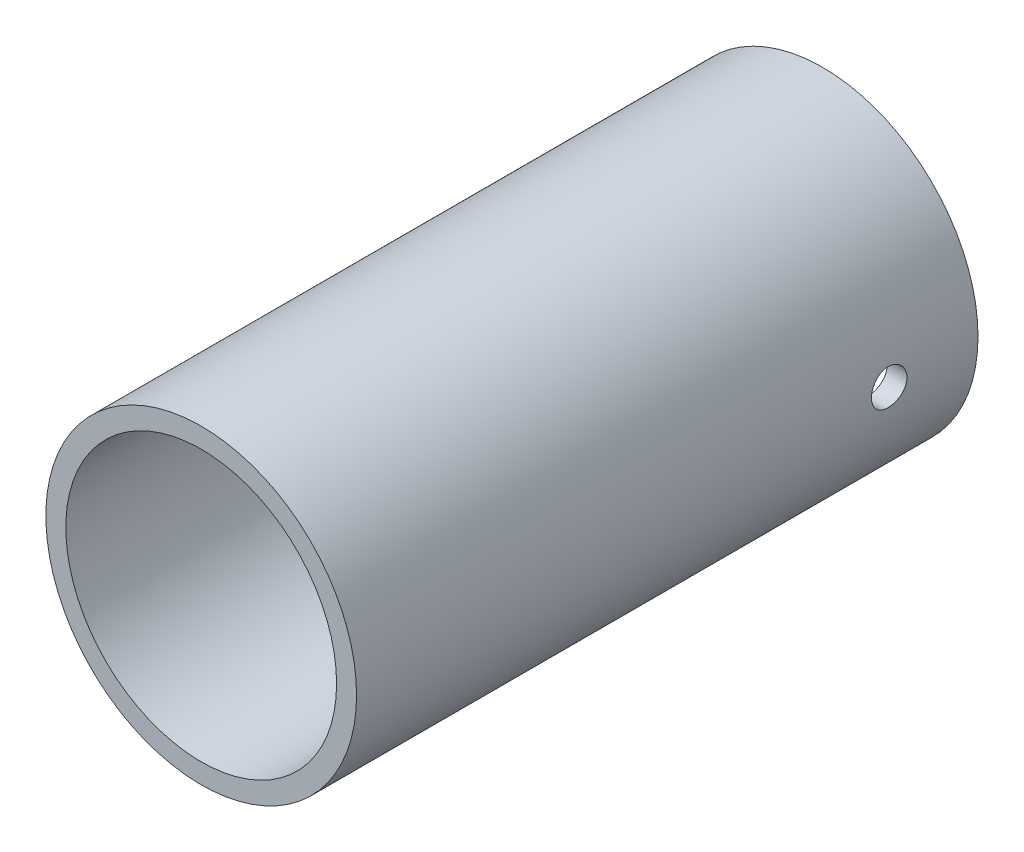
ISO-10303-21;
HEADER;
FILE_DESCRIPTION(('STEP AP214'),'2;1');
FILE_NAME('part.step','',(''),(''),'','','');
FILE_SCHEMA(('AUTOMOTIVE_DESIGN { 1 0 10303 214 1 1 1 1 }'));
ENDSEC;
DATA;
#1=APPLICATION_CONTEXT('core data for automotive mechanical design processes');
#2=APPLICATION_PROTOCOL_DEFINITION('international standard','automotive_design',2000,#1);
#3=PRODUCT_CONTEXT('',#1,'mechanical');
#4=PRODUCT('Part','Part','',(#3));
#5=PRODUCT_RELATED_PRODUCT_CATEGORY('part','',(#4));
#6=PRODUCT_DEFINITION_FORMATION('','',#4);
#7=PRODUCT_DEFINITION_CONTEXT('part definition',#1,'design');
#8=PRODUCT_DEFINITION('design','',#6,#7);
#9=PRODUCT_DEFINITION_SHAPE('','',#8);
#10=(LENGTH_UNIT() NAMED_UNIT(*) SI_UNIT(.MILLI.,.METRE.));
#11=(NAMED_UNIT(*) PLANE_ANGLE_UNIT() SI_UNIT($,.RADIAN.));
#12=(NAMED_UNIT(*) SI_UNIT($,.STERADIAN.) SOLID_ANGLE_UNIT());
#13=UNCERTAINTY_MEASURE_WITH_UNIT(LENGTH_MEASURE(1.E-05),#10,'distance_accuracy_value','');
#14=(GEOMETRIC_REPRESENTATION_CONTEXT(3) GLOBAL_UNCERTAINTY_ASSIGNED_CONTEXT((#13)) GLOBAL_UNIT_ASSIGNED_CONTEXT((#10,
#11,#12)) REPRESENTATION_CONTEXT('',''));
#15=CARTESIAN_POINT('',(0.,0.,0.));
#16=DIRECTION('',(0.,0.,1.));
#17=DIRECTION('',(1.,0.,0.));
#18=AXIS2_PLACEMENT_3D('',#15,#16,#17);
#19=CARTESIAN_POINT('',(0.,0.,7.));
#20=DIRECTION('',(0.,0.,1.));
#21=DIRECTION('',(1.,0.,0.));
#22=AXIS2_PLACEMENT_3D('',#19,#20,#21);
#23=PLANE('',#22);
#24=CARTESIAN_POINT('',(0.,0.,7.));
#25=DIRECTION('',(0.,0.,1.));
#26=DIRECTION('',(1.,0.,0.));
#27=AXIS2_PLACEMENT_3D('',#24,#25,#26);
#28=CIRCLE('',#27,3.5);
#29=CARTESIAN_POINT('',(3.5,0.,7.));
#30=VERTEX_POINT('',#29);
#31=EDGE_CURVE('E10',#30,#30,#28,.T.);
#32=ORIENTED_EDGE('',*,*,#31,.T.);
#33=EDGE_LOOP('',(#32));
#34=FACE_BOUND('',#33,.T.);
#35=CARTESIAN_POINT('',(0.,0.,7.));
#36=DIRECTION('',(0.,0.,1.));
#37=DIRECTION('',(1.,0.,0.));
#38=AXIS2_PLACEMENT_3D('',#35,#36,#37);
#39=CIRCLE('',#38,3.05);
#40=CARTESIAN_POINT('',(3.05,0.,7.));
#41=VERTEX_POINT('',#40);
#42=EDGE_CURVE('E59',#41,#41,#39,.T.);
#43=ORIENTED_EDGE('',*,*,#42,.F.);
#44=EDGE_LOOP('',(#43));
#45=FACE_BOUND('',#44,.T.);
#46=ADVANCED_FACE('F45',(#34,#45),#23,.T.);
#47=CARTESIAN_POINT('',(0.,0.,7.));
#48=DIRECTION('',(0.,0.,-1.));
#49=DIRECTION('',(-1.,0.,0.));
#50=AXIS2_PLACEMENT_3D('',#47,#48,#49);
#51=CYLINDRICAL_SURFACE('',#50,3.5);
#52=CARTESIAN_POINT('',(3.5,0.,-5.4));
#53=CARTESIAN_POINT('',(3.49999971021365,-0.0223898562262544,-5.39999903994444));
#54=CARTESIAN_POINT('',(3.49978287933917,-0.0447940740568337,-5.39811376938266));
#55=CARTESIAN_POINT('',(3.49893875155386,-0.088980124516647,-5.3906222228669));
#56=CARTESIAN_POINT('',(3.49831101528996,-0.110761264884781,-5.38501196394521));
#57=CARTESIAN_POINT('',(3.49671585949015,-0.153054999142426,-5.37023698790855));
#58=CARTESIAN_POINT('',(3.49574865798154,-0.173568397338889,-5.36107455184553));
#59=CARTESIAN_POINT('',(3.4935824066351,-0.212762120472353,-5.33946005185796));
#60=CARTESIAN_POINT('',(3.49238339945121,-0.231442781694507,-5.32700859298347));
#61=CARTESIAN_POINT('',(3.48988138768098,-0.266531567029554,-5.29910765525852));
#62=CARTESIAN_POINT('',(3.48857797358678,-0.282929975324166,-5.2836459931241));
#63=CARTESIAN_POINT('',(3.48601739052391,-0.312905159159939,-5.25018964873297));
#64=CARTESIAN_POINT('',(3.48476022381226,-0.32648179714095,-5.23219484305824));
#65=CARTESIAN_POINT('',(3.48243039132275,-0.350463500935835,-5.19412084650819));
#66=CARTESIAN_POINT('',(3.48135825114113,-0.360859594532153,-5.1740359693672));
#67=CARTESIAN_POINT('',(3.47952514217531,-0.378127810821553,-5.13239120751369));
#68=CARTESIAN_POINT('',(3.47876416347773,-0.385000045784079,-5.11083136981794));
#69=CARTESIAN_POINT('',(3.47764337133823,-0.394996241203211,-5.0669488373591));
#70=CARTESIAN_POINT('',(3.47728181496355,-0.398136491262388,-5.04462989855473));
#71=CARTESIAN_POINT('',(3.47699544141153,-0.400629959278033,-4.99977908131659));
#72=CARTESIAN_POINT('',(3.47707060945071,-0.399983305424283,-4.97724721011652));
#73=CARTESIAN_POINT('',(3.47764759753757,-0.39493471755652,-4.93272308460977));
#74=CARTESIAN_POINT('',(3.47814738711682,-0.390550654860013,-4.91072877384157));
#75=CARTESIAN_POINT('',(3.47951413666169,-0.378179545724229,-4.86779012378032));
#76=CARTESIAN_POINT('',(3.48038110294438,-0.370192437296331,-4.8468458025587));
#77=CARTESIAN_POINT('',(3.48238684044008,-0.350822517381259,-4.80654571818735));
#78=CARTESIAN_POINT('',(3.48352623797615,-0.339431865810801,-4.78719375575374));
#79=CARTESIAN_POINT('',(3.48594795433517,-0.31358381782792,-4.75066934145126));
#80=CARTESIAN_POINT('',(3.48723027862444,-0.299126304102315,-4.73349697299607));
#81=CARTESIAN_POINT('',(3.48980240183633,-0.267455532201409,-4.70171542166145));
#82=CARTESIAN_POINT('',(3.49109220119919,-0.250226856097098,-4.68712159860465));
#83=CARTESIAN_POINT('',(3.49352699828405,-0.213556108689289,-4.66103074927563));
#84=CARTESIAN_POINT('',(3.49467199575855,-0.194114033602624,-4.64953372829661));
#85=CARTESIAN_POINT('',(3.49668872991965,-0.15355707998184,-4.6299631164025));
#86=CARTESIAN_POINT('',(3.49756039646041,-0.132441773779521,-4.62189040409223));
#87=CARTESIAN_POINT('',(3.49893158874182,-0.0891432011111847,-4.60940932993522));
#88=CARTESIAN_POINT('',(3.49943112903215,-0.0669599764355738,-4.60500082482169));
#89=CARTESIAN_POINT('',(3.49999990392717,-0.0222881694378285,-4.59999302161163));
#90=CARTESIAN_POINT('',(3.50007153055525,0.000198009852777008,-4.59937254811419));
#91=CARTESIAN_POINT('',(3.49978284603153,0.0449540286429058,-4.60190265984528));
#92=CARTESIAN_POINT('',(3.49942254253953,0.067223871971853,-4.60505317819935));
#93=CARTESIAN_POINT('',(3.49831198791391,0.110853198887709,-4.61501826071912));
#94=CARTESIAN_POINT('',(3.49756280271168,0.13221499914308,-4.62182281087321));
#95=CARTESIAN_POINT('',(3.49575843499789,0.173494121309308,-4.63889244447533));
#96=CARTESIAN_POINT('',(3.49470324367418,0.193411401601285,-4.64915762758152));
#97=CARTESIAN_POINT('',(3.49239871093812,0.23133121113976,-4.67290895213295));
#98=CARTESIAN_POINT('',(3.49114854619441,0.249325048496218,-4.68640888926225));
#99=CARTESIAN_POINT('',(3.48859672381109,0.282798965373991,-4.71622687188116));
#100=CARTESIAN_POINT('',(3.4872950644741,0.29827896194751,-4.73254501032472));
#101=CARTESIAN_POINT('',(3.48477965930972,0.326360178574667,-4.76762906488034));
#102=CARTESIAN_POINT('',(3.4835663588079,0.338947424431311,-4.78640620242613));
#103=CARTESIAN_POINT('',(3.48137213485487,0.36078951188421,-4.82582038441006));
#104=CARTESIAN_POINT('',(3.48039120740389,0.370044410840425,-4.84645739682638));
#105=CARTESIAN_POINT('',(3.47877572574987,0.384936115399212,-4.88895914255295));
#106=CARTESIAN_POINT('',(3.47814039881523,0.390580997682981,-4.91082101535791));
#107=CARTESIAN_POINT('',(3.47728575983274,0.398118534828238,-4.95519000218505));
#108=CARTESIAN_POINT('',(3.4770664318414,0.400011333491316,-4.97769709144527));
#109=CARTESIAN_POINT('',(3.4770690327478,0.399988629374111,-5.02257866152777));
#110=CARTESIAN_POINT('',(3.47728841817671,0.398095078201033,-5.04495315680461));
#111=CARTESIAN_POINT('',(3.47813827936561,0.390599701753458,-5.08906379761761));
#112=CARTESIAN_POINT('',(3.47876875537848,0.38499787419795,-5.11079994276111));
#113=CARTESIAN_POINT('',(3.48036900976955,0.370251466013705,-5.15301520867245));
#114=CARTESIAN_POINT('',(3.48133870455158,0.361107758177137,-5.17349463768191));
#115=CARTESIAN_POINT('',(3.48350828979623,0.339539332785358,-5.21263183632125));
#116=CARTESIAN_POINT('',(3.48470818125814,0.327114600987134,-5.23128959804274));
#117=CARTESIAN_POINT('',(3.48721130366565,0.2992548552238,-5.26636622672522));
#118=CARTESIAN_POINT('',(3.48851507274317,0.283803467202948,-5.28277205078111));
#119=CARTESIAN_POINT('',(3.49107421229161,0.250362623026178,-5.31276685478803));
#120=CARTESIAN_POINT('',(3.49232957120036,0.232372565262226,-5.32635516516098));
#121=CARTESIAN_POINT('',(3.49465479223622,0.194300034110024,-5.3503652344662));
#122=CARTESIAN_POINT('',(3.49572404690299,0.174211038832958,-5.36077670421353));
#123=CARTESIAN_POINT('',(3.49755026854777,0.132569587879359,-5.37806404242304));
#124=CARTESIAN_POINT('',(3.49830758051356,0.111018779769742,-5.38494381878794));
#125=CARTESIAN_POINT('',(3.49923848958367,0.074459617138529,-5.39329422045302));
#126=CARTESIAN_POINT('',(3.49952269210682,0.0596833261820646,-5.39580535575123));
#127=CARTESIAN_POINT('',(3.4999035436688,0.0299401637320372,-5.39915856170394));
#128=CARTESIAN_POINT('',(3.50000019379562,0.0149732933445127,-5.40000064204046));
#129=CARTESIAN_POINT('',(3.5,0.,-5.4));
#130=B_SPLINE_CURVE_WITH_KNOTS('',3,(#52,#53,#54,#55,#56,#57,#58,#59,#60,#61,#62,#63,#64,#65,
#66,#67,#68,#69,#70,#71,#72,#73,#74,#75,#76,#77,#78,#79,#80,#81,#82,#83,#84,#85,#86,#87,#88,#89,
#90,#91,#92,#93,#94,#95,#96,#97,#98,#99,#100,#101,#102,#103,#104,#105,#106,#107,#108,#109,#110,
#111,#112,#113,#114,#115,#116,#117,#118,#119,#120,#121,#122,#123,#124,#125,#126,#127,#128,#129),
.UNSPECIFIED.,.T.,.F.,(4,2,2,2,2,2,2,2,2,2,2,2,2,2,2,2,2,2,2,2,2,2,2,2,2,2,2,2,2,2,2,2,2,2,2,2,
2,2,4),(0.,0.0671148833328561,0.134301645503665,0.201445334563241,0.268576680432396,
0.335985599789753,0.403397804534027,0.470998459859539,0.538596961307605,0.605899308004499,
0.673199376475319,0.74017942704648,0.807160630020253,0.87429732993756,0.941436598421781,
1.0089632245958,1.07648996618884,1.14403402324395,1.2115754392709,1.27873894505867,
1.34590125979196,1.41288044606783,1.47986156135286,1.54713359017113,1.614407838276,
1.6820005437816,1.74959208575276,1.81703187135957,1.88446907223297,1.95151643514368,
2.01856383929617,2.08559473208865,2.15262591586881,2.22003028269161,2.28745064975239,
2.35508711583513,2.42264857835784,2.46753214774395,2.51241545676436),.UNSPECIFIED.);
#131=CARTESIAN_POINT('',(3.5,0.,-5.4));
#132=VERTEX_POINT('',#131);
#133=EDGE_CURVE('E86',#132,#132,#130,.T.);
#134=ORIENTED_EDGE('',*,*,#133,.T.);
#135=EDGE_LOOP('',(#134));
#136=FACE_BOUND('',#135,.T.);
#137=CARTESIAN_POINT('',(-3.5,0.,-5.4));
#138=CARTESIAN_POINT('',(-3.49999971021365,0.0223898562262544,-5.39999903994444));
#139=CARTESIAN_POINT('',(-3.49978287933917,0.0447940740568337,-5.39811376938266));
#140=CARTESIAN_POINT('',(-3.49893875155386,0.088980124516647,-5.3906222228669));
#141=CARTESIAN_POINT('',(-3.49831101528996,0.110761264884781,-5.38501196394521));
#142=CARTESIAN_POINT('',(-3.49671585949015,0.153054999142426,-5.37023698790855));
#143=CARTESIAN_POINT('',(-3.49574865798154,0.173568397338889,-5.36107455184553));
#144=CARTESIAN_POINT('',(-3.4935824066351,0.212762120472353,-5.33946005185796));
#145=CARTESIAN_POINT('',(-3.49238339945121,0.231442781694507,-5.32700859298347));
#146=CARTESIAN_POINT('',(-3.48988138768098,0.266531567029554,-5.29910765525852));
#147=CARTESIAN_POINT('',(-3.48857797358678,0.282929975324166,-5.2836459931241));
#148=CARTESIAN_POINT('',(-3.48601739052391,0.312905159159939,-5.25018964873297));
#149=CARTESIAN_POINT('',(-3.48476022381226,0.32648179714095,-5.23219484305824));
#150=CARTESIAN_POINT('',(-3.48243039132275,0.350463500935835,-5.19412084650819));
#151=CARTESIAN_POINT('',(-3.48135825114113,0.360859594532153,-5.1740359693672));
#152=CARTESIAN_POINT('',(-3.47952514217531,0.378127810821553,-5.13239120751369));
#153=CARTESIAN_POINT('',(-3.47876416347773,0.385000045784079,-5.11083136981794));
#154=CARTESIAN_POINT('',(-3.47764337133823,0.394996241203211,-5.0669488373591));
#155=CARTESIAN_POINT('',(-3.47728181496355,0.398136491262388,-5.04462989855473));
#156=CARTESIAN_POINT('',(-3.47699544141153,0.400629959278033,-4.99977908131659));
#157=CARTESIAN_POINT('',(-3.47707060945071,0.399983305424283,-4.97724721011652));
#158=CARTESIAN_POINT('',(-3.47764759753757,0.39493471755652,-4.93272308460977));
#159=CARTESIAN_POINT('',(-3.47814738711682,0.390550654860013,-4.91072877384157));
#160=CARTESIAN_POINT('',(-3.47951413666169,0.378179545724229,-4.86779012378032));
#161=CARTESIAN_POINT('',(-3.48038110294438,0.370192437296331,-4.8468458025587));
#162=CARTESIAN_POINT('',(-3.48238684044008,0.350822517381259,-4.80654571818735));
#163=CARTESIAN_POINT('',(-3.48352623797615,0.339431865810801,-4.78719375575374));
#164=CARTESIAN_POINT('',(-3.48594795433517,0.31358381782792,-4.75066934145126));
#165=CARTESIAN_POINT('',(-3.48723027862444,0.299126304102315,-4.73349697299607));
#166=CARTESIAN_POINT('',(-3.48980240183633,0.267455532201409,-4.70171542166145));
#167=CARTESIAN_POINT('',(-3.49109220119919,0.250226856097098,-4.68712159860465));
#168=CARTESIAN_POINT('',(-3.49352699828405,0.213556108689289,-4.66103074927563));
#169=CARTESIAN_POINT('',(-3.49467199575855,0.194114033602624,-4.64953372829661));
#170=CARTESIAN_POINT('',(-3.49668872991965,0.15355707998184,-4.6299631164025));
#171=CARTESIAN_POINT('',(-3.49756039646041,0.132441773779521,-4.62189040409223));
#172=CARTESIAN_POINT('',(-3.49893158874182,0.0891432011111847,-4.60940932993522));
#173=CARTESIAN_POINT('',(-3.49943112903215,0.0669599764355738,-4.60500082482169));
#174=CARTESIAN_POINT('',(-3.49999990392717,0.0222881694378285,-4.59999302161163));
#175=CARTESIAN_POINT('',(-3.50007153055525,-0.000198009852777008,-4.59937254811419));
#176=CARTESIAN_POINT('',(-3.49978284603153,-0.0449540286429058,-4.60190265984528));
#177=CARTESIAN_POINT('',(-3.49942254253953,-0.067223871971853,-4.60505317819935));
#178=CARTESIAN_POINT('',(-3.49831198791391,-0.110853198887709,-4.61501826071912));
#179=CARTESIAN_POINT('',(-3.49756280271168,-0.13221499914308,-4.62182281087321));
#180=CARTESIAN_POINT('',(-3.49575843499789,-0.173494121309308,-4.63889244447533));
#181=CARTESIAN_POINT('',(-3.49470324367418,-0.193411401601285,-4.64915762758152));
#182=CARTESIAN_POINT('',(-3.49239871093812,-0.23133121113976,-4.67290895213295));
#183=CARTESIAN_POINT('',(-3.49114854619441,-0.249325048496218,-4.68640888926225));
#184=CARTESIAN_POINT('',(-3.48859672381109,-0.282798965373991,-4.71622687188116));
#185=CARTESIAN_POINT('',(-3.4872950644741,-0.29827896194751,-4.73254501032472));
#186=CARTESIAN_POINT('',(-3.48477965930972,-0.326360178574667,-4.76762906488034));
#187=CARTESIAN_POINT('',(-3.4835663588079,-0.338947424431311,-4.78640620242613));
#188=CARTESIAN_POINT('',(-3.48137213485487,-0.36078951188421,-4.82582038441006));
#189=CARTESIAN_POINT('',(-3.48039120740389,-0.370044410840425,-4.84645739682638));
#190=CARTESIAN_POINT('',(-3.47877572574987,-0.384936115399212,-4.88895914255295));
#191=CARTESIAN_POINT('',(-3.47814039881523,-0.390580997682981,-4.91082101535791));
#192=CARTESIAN_POINT('',(-3.47728575983274,-0.398118534828238,-4.95519000218505));
#193=CARTESIAN_POINT('',(-3.4770664318414,-0.400011333491316,-4.97769709144527));
#194=CARTESIAN_POINT('',(-3.4770690327478,-0.399988629374111,-5.02257866152777));
#195=CARTESIAN_POINT('',(-3.47728841817671,-0.398095078201033,-5.04495315680461));
#196=CARTESIAN_POINT('',(-3.47813827936561,-0.390599701753458,-5.08906379761761));
#197=CARTESIAN_POINT('',(-3.47876875537848,-0.38499787419795,-5.11079994276111));
#198=CARTESIAN_POINT('',(-3.48036900976955,-0.370251466013705,-5.15301520867245));
#199=CARTESIAN_POINT('',(-3.48133870455158,-0.361107758177137,-5.17349463768191));
#200=CARTESIAN_POINT('',(-3.48350828979623,-0.339539332785358,-5.21263183632125));
#201=CARTESIAN_POINT('',(-3.48470818125814,-0.327114600987134,-5.23128959804274));
#202=CARTESIAN_POINT('',(-3.48721130366565,-0.2992548552238,-5.26636622672522));
#203=CARTESIAN_POINT('',(-3.48851507274317,-0.283803467202948,-5.28277205078111));
#204=CARTESIAN_POINT('',(-3.49107421229161,-0.250362623026178,-5.31276685478803));
#205=CARTESIAN_POINT('',(-3.49232957120036,-0.232372565262226,-5.32635516516098));
#206=CARTESIAN_POINT('',(-3.49465479223622,-0.194300034110024,-5.3503652344662));
#207=CARTESIAN_POINT('',(-3.49572404690299,-0.174211038832958,-5.36077670421353));
#208=CARTESIAN_POINT('',(-3.49755026854777,-0.132569587879359,-5.37806404242304));
#209=CARTESIAN_POINT('',(-3.49830758051356,-0.111018779769742,-5.38494381878794));
#210=CARTESIAN_POINT('',(-3.49923848958367,-0.074459617138529,-5.39329422045302));
#211=CARTESIAN_POINT('',(-3.49952269210682,-0.0596833261820646,-5.39580535575123));
#212=CARTESIAN_POINT('',(-3.4999035436688,-0.0299401637320372,-5.39915856170394));
#213=CARTESIAN_POINT('',(-3.50000019379562,-0.0149732933445127,-5.40000064204046));
#214=CARTESIAN_POINT('',(-3.5,0.,-5.4));
#215=B_SPLINE_CURVE_WITH_KNOTS('',3,(#137,#138,#139,#140,#141,#142,#143,#144,#145,#146,#147,
#148,#149,#150,#151,#152,#153,#154,#155,#156,#157,#158,#159,#160,#161,#162,#163,#164,#165,#166,
#167,#168,#169,#170,#171,#172,#173,#174,#175,#176,#177,#178,#179,#180,#181,#182,#183,#184,#185,
#186,#187,#188,#189,#190,#191,#192,#193,#194,#195,#196,#197,#198,#199,#200,#201,#202,#203,#204,
#205,#206,#207,#208,#209,#210,#211,#212,#213,#214),.UNSPECIFIED.,.T.,.F.,(4,2,2,2,2,2,2,2,2,2,2,
2,2,2,2,2,2,2,2,2,2,2,2,2,2,2,2,2,2,2,2,2,2,2,2,2,2,2,4),(0.,0.0671148833328561,
0.134301645503665,0.201445334563241,0.268576680432396,0.335985599789753,0.403397804534027,
0.470998459859539,0.538596961307605,0.605899308004499,0.673199376475319,0.74017942704648,
0.807160630020253,0.87429732993756,0.941436598421781,1.0089632245958,1.07648996618884,
1.14403402324395,1.2115754392709,1.27873894505867,1.34590125979196,1.41288044606783,
1.47986156135286,1.54713359017113,1.614407838276,1.6820005437816,1.74959208575276,
1.81703187135957,1.88446907223297,1.95151643514368,2.01856383929617,2.08559473208865,
2.15262591586881,2.22003028269161,2.28745064975239,2.35508711583513,2.42264857835784,
2.46753214774395,2.51241545676436),.UNSPECIFIED.);
#216=CARTESIAN_POINT('',(-3.5,0.,-5.4));
#217=VERTEX_POINT('',#216);
#218=EDGE_CURVE('E91',#217,#217,#215,.T.);
#219=ORIENTED_EDGE('',*,*,#218,.T.);
#220=EDGE_LOOP('',(#219));
#221=FACE_BOUND('',#220,.T.);
#222=ORIENTED_EDGE('',*,*,#31,.F.);
#223=EDGE_LOOP('',(#222));
#224=FACE_BOUND('',#223,.T.);
#225=CARTESIAN_POINT('',(0.,0.,-7.));
#226=DIRECTION('',(0.,0.,1.));
#227=DIRECTION('',(1.,0.,0.));
#228=AXIS2_PLACEMENT_3D('',#225,#226,#227);
#229=CIRCLE('',#228,3.5);
#230=CARTESIAN_POINT('',(3.5,0.,-7.));
#231=VERTEX_POINT('',#230);
#232=EDGE_CURVE('E64',#231,#231,#229,.T.);
#233=ORIENTED_EDGE('',*,*,#232,.T.);
#234=EDGE_LOOP('',(#233));
#235=FACE_BOUND('',#234,.T.);
#236=ADVANCED_FACE('F47',(#136,#221,#224,#235),#51,.T.);
#237=CARTESIAN_POINT('',(0.,0.,7.));
#238=DIRECTION('',(0.,0.,-1.));
#239=DIRECTION('',(-1.,0.,0.));
#240=AXIS2_PLACEMENT_3D('',#237,#238,#239);
#241=CYLINDRICAL_SURFACE('',#240,3.05);
#242=CARTESIAN_POINT('',(-3.05,0.,-4.6));
#243=CARTESIAN_POINT('',(-3.04999967567675,-0.0223652045310429,-4.60000094430966));
#244=CARTESIAN_POINT('',(-3.04975140532122,-0.0447441565428265,-4.60188208533576));
#245=CARTESIAN_POINT('',(-3.0487848893789,-0.0888786894735394,-4.60935626715322));
#246=CARTESIAN_POINT('',(-3.04806616066089,-0.110633605547908,-4.6149531238356));
#247=CARTESIAN_POINT('',(-3.04623965094681,-0.152874790274292,-4.62969045314019));
#248=CARTESIAN_POINT('',(-3.04513213930745,-0.17336192574065,-4.63882847282697));
#249=CARTESIAN_POINT('',(-3.04265105781359,-0.212508188004251,-4.66038321727098));
#250=CARTESIAN_POINT('',(-3.04127753160043,-0.231167613893463,-4.67279940434586));
#251=CARTESIAN_POINT('',(-3.03840836293451,-0.266245130495356,-4.70063808809834));
#252=CARTESIAN_POINT('',(-3.03691210207143,-0.282650595866473,-4.71607643094902));
#253=CARTESIAN_POINT('',(-3.0339710542058,-0.31264571972163,-4.74948714004339));
#254=CARTESIAN_POINT('',(-3.03252626990361,-0.32623523066544,-4.76745963897979));
#255=CARTESIAN_POINT('',(-3.02984569939782,-0.350260232692426,-4.80551121129021));
#256=CARTESIAN_POINT('',(-3.02861071073445,-0.36068380167134,-4.82559787307311));
#257=CARTESIAN_POINT('',(-3.02649779574097,-0.378004884745517,-4.8672555421107));
#258=CARTESIAN_POINT('',(-3.02561985452974,-0.384902545797728,-4.88882648745915));
#259=CARTESIAN_POINT('',(-3.02432639244563,-0.394937441949649,-4.93270892114188));
#260=CARTESIAN_POINT('',(-3.02390824176772,-0.398096070752991,-4.95501543835037));
#261=CARTESIAN_POINT('',(-3.02357367480987,-0.400629457699287,-4.99984555188705));
#262=CARTESIAN_POINT('',(-3.02365723638528,-0.400004382847933,-5.02236913859038));
#263=CARTESIAN_POINT('',(-3.02431424596193,-0.395005649426819,-5.06684447028074));
#264=CARTESIAN_POINT('',(-3.0248846063809,-0.390655616296935,-5.08879892272459));
#265=CARTESIAN_POINT('',(-3.0264461313835,-0.378367337172484,-5.13166353902046));
#266=CARTESIAN_POINT('',(-3.02743730527565,-0.370429011803466,-5.15257367976055));
#267=CARTESIAN_POINT('',(-3.02973225760621,-0.351164283947918,-5.19282915783753));
#268=CARTESIAN_POINT('',(-3.03103697540731,-0.339827674625178,-5.21216955483477));
#269=CARTESIAN_POINT('',(-3.03381129239396,-0.314095477495971,-5.24868238573322));
#270=CARTESIAN_POINT('',(-3.03528089987459,-0.299699735761801,-5.26585471047324));
#271=CARTESIAN_POINT('',(-3.03823311573054,-0.268127269313213,-5.2976810211139));
#272=CARTESIAN_POINT('',(-3.03971573785138,-0.250930192272551,-5.31231482330171));
#273=CARTESIAN_POINT('',(-3.04251647181268,-0.214313128935372,-5.33849133222503));
#274=CARTESIAN_POINT('',(-3.04383458320572,-0.194893136593448,-5.35003403055373));
#275=CARTESIAN_POINT('',(-3.04615871780272,-0.154365497304131,-5.36970092531347));
#276=CARTESIAN_POINT('',(-3.0471646194519,-0.133257197048755,-5.37782379071498));
#277=CARTESIAN_POINT('',(-3.04874991788146,-0.0899600819396528,-5.39040407025288));
#278=CARTESIAN_POINT('',(-3.04932933665476,-0.0677713228661068,-5.39486167340144));
#279=CARTESIAN_POINT('',(-3.04999351374235,-0.0231175917834736,-5.39995857819447));
#280=CARTESIAN_POINT('',(-3.05008187228908,-0.000655843403997384,-5.40062567096565));
#281=CARTESIAN_POINT('',(-3.04976371212408,0.0440591418582799,-5.39819605738443));
#282=CARTESIAN_POINT('',(-3.0493572050396,0.0663123836277246,-5.39509943946331));
#283=CARTESIAN_POINT('',(-3.04809722704062,0.109896165213696,-5.38525339972195));
#284=CARTESIAN_POINT('',(-3.04724538604789,0.131229764739027,-5.37851729542854));
#285=CARTESIAN_POINT('',(-3.04519006652876,0.172464582125677,-5.36159738736461));
#286=CARTESIAN_POINT('',(-3.04398657497835,0.192365746900146,-5.35141345589534));
#287=CARTESIAN_POINT('',(-3.04135305166816,0.23029445404851,-5.32782020817234));
#288=CARTESIAN_POINT('',(-3.03992177843504,0.248310775755855,-5.31439299447293));
#289=CARTESIAN_POINT('',(-3.03699650727889,0.281844059217536,-5.28471955835665));
#290=CARTESIAN_POINT('',(-3.03550250660692,0.297360911291633,-5.26847321229724));
#291=CARTESIAN_POINT('',(-3.03260898392204,0.325553973391073,-5.23349996004918));
#292=CARTESIAN_POINT('',(-3.03121011489502,0.338211712418732,-5.21475810182059));
#293=CARTESIAN_POINT('',(-3.02867617432123,0.360199457524109,-5.17539806909127));
#294=CARTESIAN_POINT('',(-3.0275410970434,0.369529535899879,-5.15477993536745));
#295=CARTESIAN_POINT('',(-3.02566777588543,0.384567499539058,-5.11231118280736));
#296=CARTESIAN_POINT('',(-3.02492840950823,0.390285639049092,-5.09046424658905));
#297=CARTESIAN_POINT('',(-3.0239270606461,0.397970348714084,-5.04610990089657));
#298=CARTESIAN_POINT('',(-3.02366505352349,0.399937112486985,-5.0236025255702));
#299=CARTESIAN_POINT('',(-3.02364885482862,0.400059446602371,-4.97875003544065));
#300=CARTESIAN_POINT('',(-3.02389079618287,0.398244039596346,-4.95640499567179));
#301=CARTESIAN_POINT('',(-3.02484689920391,0.390915192292119,-4.91234064544701));
#302=CARTESIAN_POINT('',(-3.02556106075715,0.385401752883166,-4.89062133484061));
#303=CARTESIAN_POINT('',(-3.02737990419805,0.370842701726876,-4.84842977182245));
#304=CARTESIAN_POINT('',(-3.02848441527791,0.361798634718601,-4.82795697854992));
#305=CARTESIAN_POINT('',(-3.03095977032639,0.340437908229655,-4.78881484170646));
#306=CARTESIAN_POINT('',(-3.03233061895498,0.328121191487853,-4.77014552969861));
#307=CARTESIAN_POINT('',(-3.03519677742117,0.300457599639196,-4.73499213561121));
#308=CARTESIAN_POINT('',(-3.03669292799225,0.285089118241545,-4.71852512354027));
#309=CARTESIAN_POINT('',(-3.03963377898097,0.251803561772006,-4.68839288369009));
#310=CARTESIAN_POINT('',(-3.04107846723062,0.233885888893133,-4.67472831494791));
#311=CARTESIAN_POINT('',(-3.04376035131562,0.195924018168824,-4.65053955008888));
#312=CARTESIAN_POINT('',(-3.04499665462743,0.175871244846095,-4.64002871893526));
#313=CARTESIAN_POINT('',(-3.04711351891615,0.134279746364772,-4.62253900322909));
#314=CARTESIAN_POINT('',(-3.04799446210933,0.112742647070003,-4.61555632183529));
#315=CARTESIAN_POINT('',(-3.04909155056231,0.0759144688872918,-4.60697269104741));
#316=CARTESIAN_POINT('',(-3.04943053904308,0.0608545892345614,-4.6043617434999));
#317=CARTESIAN_POINT('',(-3.0498848735313,0.0305319411792384,-4.60087508293264));
#318=CARTESIAN_POINT('',(-3.050000221422,0.0152691744862213,-4.59999935530082));
#319=CARTESIAN_POINT('',(-3.05,0.,-4.6));
#320=B_SPLINE_CURVE_WITH_KNOTS('',3,(#242,#243,#244,#245,#246,#247,#248,#249,#250,#251,#252,
#253,#254,#255,#256,#257,#258,#259,#260,#261,#262,#263,#264,#265,#266,#267,#268,#269,#270,#271,
#272,#273,#274,#275,#276,#277,#278,#279,#280,#281,#282,#283,#284,#285,#286,#287,#288,#289,#290,
#291,#292,#293,#294,#295,#296,#297,#298,#299,#300,#301,#302,#303,#304,#305,#306,#307,#308,#309,
#310,#311,#312,#313,#314,#315,#316,#317,#318,#319),.UNSPECIFIED.,.T.,.F.,(4,2,2,2,2,2,2,2,2,2,2,
2,2,2,2,2,2,2,2,2,2,2,2,2,2,2,2,2,2,2,2,2,2,2,2,2,2,2,4),(0.,0.067039835278284,
0.134148624498459,0.201211010849139,0.268262404507546,0.335675272420039,0.403091671496444,
0.470758882220357,0.538423272400469,0.605698605051119,0.672970968314477,0.739819792317132,
0.806670095114702,0.873723231413717,0.940779742453937,1.0083471486134,1.07591473853259,
1.14350860210416,1.21109897974119,1.27819315485994,1.34528575357992,1.41213449501283,
1.47898571262398,1.54621462066162,1.61344647799502,1.68110099004229,1.74875403211172,
1.81621413449457,1.88367075499754,1.95061165131045,2.0175525315264,2.08446415617685,
2.15137695164849,2.21878155632289,2.28620199408255,2.35390423793764,2.4215334675728,
2.46730329547881,2.51307273796125),.UNSPECIFIED.);
#321=CARTESIAN_POINT('',(-3.05,0.,-4.6));
#322=VERTEX_POINT('',#321);
#323=EDGE_CURVE('E50',#322,#322,#320,.T.);
#324=ORIENTED_EDGE('',*,*,#323,.F.);
#325=EDGE_LOOP('',(#324));
#326=FACE_BOUND('',#325,.T.);
#327=CARTESIAN_POINT('',(3.05,0.,-5.4));
#328=CARTESIAN_POINT('',(3.04999967567675,-0.0223652045310429,-5.39999905569034));
#329=CARTESIAN_POINT('',(3.04975140532122,-0.0447441565428265,-5.39811791466424));
#330=CARTESIAN_POINT('',(3.0487848893789,-0.0888786894735394,-5.39064373284678));
#331=CARTESIAN_POINT('',(3.04806616066089,-0.110633605547908,-5.3850468761644));
#332=CARTESIAN_POINT('',(3.04623965094681,-0.152874790274292,-5.37030954685981));
#333=CARTESIAN_POINT('',(3.04513213930745,-0.17336192574065,-5.36117152717303));
#334=CARTESIAN_POINT('',(3.04265105781359,-0.212508188004251,-5.33961678272902));
#335=CARTESIAN_POINT('',(3.04127753160043,-0.231167613893464,-5.32720059565414));
#336=CARTESIAN_POINT('',(3.03840836293451,-0.266245130495356,-5.29936191190166));
#337=CARTESIAN_POINT('',(3.03691210207143,-0.282650595866473,-5.28392356905098));
#338=CARTESIAN_POINT('',(3.0339710542058,-0.312645719721631,-5.25051285995661));
#339=CARTESIAN_POINT('',(3.03252626990361,-0.326235230665441,-5.23254036102021));
#340=CARTESIAN_POINT('',(3.02984569939782,-0.350260232692426,-5.19448878870979));
#341=CARTESIAN_POINT('',(3.02861071073445,-0.36068380167134,-5.17440212692689));
#342=CARTESIAN_POINT('',(3.02649779574097,-0.378004884745517,-5.1327444578893));
#343=CARTESIAN_POINT('',(3.02561985452974,-0.384902545797728,-5.11117351254085));
#344=CARTESIAN_POINT('',(3.02432639244563,-0.394937441949649,-5.06729107885812));
#345=CARTESIAN_POINT('',(3.02390824176772,-0.398096070752991,-5.04498456164963));
#346=CARTESIAN_POINT('',(3.02357367480987,-0.400629457699287,-5.00015444811295));
#347=CARTESIAN_POINT('',(3.02365723638528,-0.400004382847933,-4.97763086140962));
#348=CARTESIAN_POINT('',(3.02431424596193,-0.395005649426819,-4.93315552971926));
#349=CARTESIAN_POINT('',(3.0248846063809,-0.390655616296935,-4.91120107727541));
#350=CARTESIAN_POINT('',(3.0264461313835,-0.378367337172484,-4.86833646097954));
#351=CARTESIAN_POINT('',(3.02743730527565,-0.370429011803466,-4.84742632023945));
#352=CARTESIAN_POINT('',(3.02973225760621,-0.351164283947918,-4.80717084216247));
#353=CARTESIAN_POINT('',(3.03103697540731,-0.339827674625178,-4.78783044516523));
#354=CARTESIAN_POINT('',(3.03381129239396,-0.314095477495971,-4.75131761426678));
#355=CARTESIAN_POINT('',(3.03528089987459,-0.299699735761801,-4.73414528952676));
#356=CARTESIAN_POINT('',(3.03823311573054,-0.268127269313213,-4.7023189788861));
#357=CARTESIAN_POINT('',(3.03971573785138,-0.250930192272551,-4.6876851766983));
#358=CARTESIAN_POINT('',(3.04251647181268,-0.214313128935373,-4.66150866777498));
#359=CARTESIAN_POINT('',(3.04383458320572,-0.194893136593448,-4.64996596944627));
#360=CARTESIAN_POINT('',(3.04615871780272,-0.154365497304131,-4.63029907468653));
#361=CARTESIAN_POINT('',(3.0471646194519,-0.133257197048755,-4.62217620928502));
#362=CARTESIAN_POINT('',(3.04874991788146,-0.0899600819396528,-4.60959592974712));
#363=CARTESIAN_POINT('',(3.04932933665476,-0.0677713228661068,-4.60513832659856));
#364=CARTESIAN_POINT('',(3.04999351374235,-0.0231175917834737,-4.60004142180553));
#365=CARTESIAN_POINT('',(3.05008187228908,-0.000655843403997422,-4.59937432903435));
#366=CARTESIAN_POINT('',(3.04976371212408,0.0440591418582799,-4.60180394261557));
#367=CARTESIAN_POINT('',(3.0493572050396,0.0663123836277246,-4.60490056053669));
#368=CARTESIAN_POINT('',(3.04809722704062,0.109896165213696,-4.61474660027805));
#369=CARTESIAN_POINT('',(3.04724538604789,0.131229764739027,-4.62148270457146));
#370=CARTESIAN_POINT('',(3.04519006652876,0.172464582125677,-4.63840261263539));
#371=CARTESIAN_POINT('',(3.04398657497835,0.192365746900146,-4.64858654410466));
#372=CARTESIAN_POINT('',(3.04135305166816,0.23029445404851,-4.67217979182766));
#373=CARTESIAN_POINT('',(3.03992177843504,0.248310775755855,-4.68560700552707));
#374=CARTESIAN_POINT('',(3.03699650727889,0.281844059217536,-4.71528044164335));
#375=CARTESIAN_POINT('',(3.03550250660692,0.297360911291632,-4.73152678770276));
#376=CARTESIAN_POINT('',(3.03260898392204,0.325553973391073,-4.76650003995082));
#377=CARTESIAN_POINT('',(3.03121011489502,0.338211712418732,-4.78524189817941));
#378=CARTESIAN_POINT('',(3.02867617432123,0.360199457524109,-4.82460193090873));
#379=CARTESIAN_POINT('',(3.0275410970434,0.369529535899879,-4.84522006463255));
#380=CARTESIAN_POINT('',(3.02566777588543,0.384567499539058,-4.88768881719265));
#381=CARTESIAN_POINT('',(3.02492840950823,0.390285639049092,-4.90953575341095));
#382=CARTESIAN_POINT('',(3.0239270606461,0.397970348714084,-4.95389009910343));
#383=CARTESIAN_POINT('',(3.02366505352349,0.399937112486985,-4.9763974744298));
#384=CARTESIAN_POINT('',(3.02364885482862,0.400059446602371,-5.02124996455935));
#385=CARTESIAN_POINT('',(3.02389079618287,0.398244039596346,-5.04359500432821));
#386=CARTESIAN_POINT('',(3.02484689920391,0.390915192292119,-5.08765935455299));
#387=CARTESIAN_POINT('',(3.02556106075715,0.385401752883166,-5.10937866515939));
#388=CARTESIAN_POINT('',(3.02737990419805,0.370842701726876,-5.15157022817755));
#389=CARTESIAN_POINT('',(3.02848441527791,0.361798634718602,-5.17204302145008));
#390=CARTESIAN_POINT('',(3.03095977032639,0.340437908229656,-5.21118515829354));
#391=CARTESIAN_POINT('',(3.03233061895498,0.328121191487853,-5.22985447030139));
#392=CARTESIAN_POINT('',(3.03519677742117,0.300457599639196,-5.26500786438879));
#393=CARTESIAN_POINT('',(3.03669292799225,0.285089118241545,-5.28147487645973));
#394=CARTESIAN_POINT('',(3.03963377898097,0.251803561772006,-5.31160711630991));
#395=CARTESIAN_POINT('',(3.04107846723062,0.233885888893133,-5.32527168505209));
#396=CARTESIAN_POINT('',(3.04376035131562,0.195924018168824,-5.34946044991112));
#397=CARTESIAN_POINT('',(3.04499665462743,0.175871244846095,-5.35997128106474));
#398=CARTESIAN_POINT('',(3.04711351891615,0.134279746364772,-5.37746099677091));
#399=CARTESIAN_POINT('',(3.04799446210933,0.112742647070003,-5.38444367816471));
#400=CARTESIAN_POINT('',(3.04909155056231,0.0759144688872917,-5.39302730895259));
#401=CARTESIAN_POINT('',(3.04943053904308,0.0608545892345613,-5.3956382565001));
#402=CARTESIAN_POINT('',(3.0498848735313,0.0305319411792382,-5.39912491706736));
#403=CARTESIAN_POINT('',(3.050000221422,0.0152691744862212,-5.40000064469918));
#404=CARTESIAN_POINT('',(3.05,0.,-5.4));
#405=B_SPLINE_CURVE_WITH_KNOTS('',3,(#327,#328,#329,#330,#331,#332,#333,#334,#335,#336,#337,
#338,#339,#340,#341,#342,#343,#344,#345,#346,#347,#348,#349,#350,#351,#352,#353,#354,#355,#356,
#357,#358,#359,#360,#361,#362,#363,#364,#365,#366,#367,#368,#369,#370,#371,#372,#373,#374,#375,
#376,#377,#378,#379,#380,#381,#382,#383,#384,#385,#386,#387,#388,#389,#390,#391,#392,#393,#394,
#395,#396,#397,#398,#399,#400,#401,#402,#403,#404),.UNSPECIFIED.,.T.,.F.,(4,2,2,2,2,2,2,2,2,2,2,
2,2,2,2,2,2,2,2,2,2,2,2,2,2,2,2,2,2,2,2,2,2,2,2,2,2,2,4),(0.,0.067039835278284,
0.134148624498459,0.201211010849139,0.268262404507546,0.33567527242004,0.403091671496444,
0.470758882220357,0.538423272400469,0.605698605051119,0.672970968314477,0.739819792317132,
0.806670095114702,0.873723231413717,0.940779742453937,1.0083471486134,1.07591473853259,
1.14350860210416,1.21109897974119,1.27819315485994,1.34528575357992,1.41213449501283,
1.47898571262398,1.54621462066162,1.61344647799502,1.68110099004229,1.74875403211172,
1.81621413449457,1.88367075499754,1.95061165131045,2.0175525315264,2.08446415617685,
2.15137695164849,2.21878155632289,2.28620199408255,2.35390423793764,2.4215334675728,
2.46730329547881,2.51307273796125),.UNSPECIFIED.);
#406=CARTESIAN_POINT('',(3.05,0.,-5.4));
#407=VERTEX_POINT('',#406);
#408=EDGE_CURVE('E67',#407,#407,#405,.T.);
#409=ORIENTED_EDGE('',*,*,#408,.F.);
#410=EDGE_LOOP('',(#409));
#411=FACE_BOUND('',#410,.T.);
#412=ORIENTED_EDGE('',*,*,#42,.T.);
#413=EDGE_LOOP('',(#412));
#414=FACE_BOUND('',#413,.T.);
#415=CARTESIAN_POINT('',(0.,0.,-7.));
#416=DIRECTION('',(0.,0.,1.));
#417=DIRECTION('',(1.,0.,0.));
#418=AXIS2_PLACEMENT_3D('',#415,#416,#417);
#419=CIRCLE('',#418,3.05);
#420=CARTESIAN_POINT('',(3.05,0.,-7.));
#421=VERTEX_POINT('',#420);
#422=EDGE_CURVE('E97',#421,#421,#419,.T.);
#423=ORIENTED_EDGE('',*,*,#422,.F.);
#424=EDGE_LOOP('',(#423));
#425=FACE_BOUND('',#424,.T.);
#426=ADVANCED_FACE('F72',(#326,#411,#414,#425),#241,.F.);
#427=CARTESIAN_POINT('',(0.,0.,-7.));
#428=DIRECTION('',(0.,0.,1.));
#429=DIRECTION('',(1.,0.,0.));
#430=AXIS2_PLACEMENT_3D('',#427,#428,#429);
#431=PLANE('',#430);
#432=ORIENTED_EDGE('',*,*,#422,.T.);
#433=EDGE_LOOP('',(#432));
#434=FACE_BOUND('',#433,.T.);
#435=ORIENTED_EDGE('',*,*,#232,.F.);
#436=EDGE_LOOP('',(#435));
#437=FACE_BOUND('',#436,.T.);
#438=ADVANCED_FACE('F80',(#434,#437),#431,.F.);
#439=CARTESIAN_POINT('',(-3.5,0.,-5.));
#440=DIRECTION('',(1.,0.,0.));
#441=DIRECTION('',(0.,0.,-1.));
#442=AXIS2_PLACEMENT_3D('',#439,#440,#441);
#443=CYLINDRICAL_SURFACE('',#442,0.4);
#444=ORIENTED_EDGE('',*,*,#408,.T.);
#445=EDGE_LOOP('',(#444));
#446=FACE_BOUND('',#445,.T.);
#447=ORIENTED_EDGE('',*,*,#133,.F.);
#448=EDGE_LOOP('',(#447));
#449=FACE_BOUND('',#448,.T.);
#450=ADVANCED_FACE('F78',(#446,#449),#443,.F.);
#451=ORIENTED_EDGE('',*,*,#323,.T.);
#452=EDGE_LOOP('',(#451));
#453=FACE_BOUND('',#452,.T.);
#454=ORIENTED_EDGE('',*,*,#218,.F.);
#455=EDGE_LOOP('',(#454));
#456=FACE_BOUND('',#455,.T.);
#457=ADVANCED_FACE('F75',(#453,#456),#443,.F.);
#458=CLOSED_SHELL('',(#46,#236,#426,#438,#450,#457));
#459=MANIFOLD_SOLID_BREP('B2',#458);
#460=ADVANCED_BREP_SHAPE_REPRESENTATION('',(#18,#459),#14);
#461=SHAPE_DEFINITION_REPRESENTATION(#9,#460);
ENDSEC;
END-ISO-10303-21;
